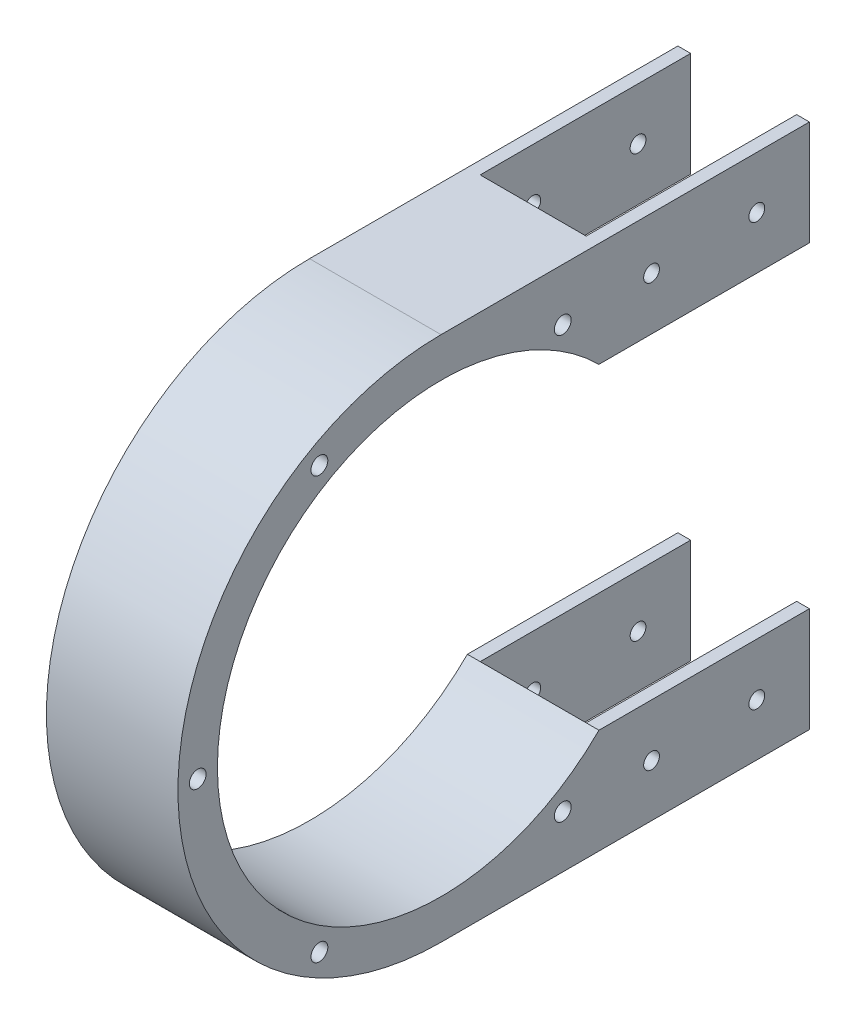
ISO-10303-21;
HEADER;
FILE_DESCRIPTION(('STEP AP214'),'2;1');
FILE_NAME('part.step','',(''),(''),'','','');
FILE_SCHEMA(('AUTOMOTIVE_DESIGN { 1 0 10303 214 1 1 1 1 }'));
ENDSEC;
DATA;
#1=APPLICATION_CONTEXT('core data for automotive mechanical design processes');
#2=APPLICATION_PROTOCOL_DEFINITION('international standard','automotive_design',2000,#1);
#3=PRODUCT_CONTEXT('',#1,'mechanical');
#4=PRODUCT('Part','Part','',(#3));
#5=PRODUCT_RELATED_PRODUCT_CATEGORY('part','',(#4));
#6=PRODUCT_DEFINITION_FORMATION('','',#4);
#7=PRODUCT_DEFINITION_CONTEXT('part definition',#1,'design');
#8=PRODUCT_DEFINITION('design','',#6,#7);
#9=PRODUCT_DEFINITION_SHAPE('','',#8);
#10=(LENGTH_UNIT() NAMED_UNIT(*) SI_UNIT(.MILLI.,.METRE.));
#11=(NAMED_UNIT(*) PLANE_ANGLE_UNIT() SI_UNIT($,.RADIAN.));
#12=(NAMED_UNIT(*) SI_UNIT($,.STERADIAN.) SOLID_ANGLE_UNIT());
#13=UNCERTAINTY_MEASURE_WITH_UNIT(LENGTH_MEASURE(1.E-05),#10,'distance_accuracy_value','');
#14=(GEOMETRIC_REPRESENTATION_CONTEXT(3) GLOBAL_UNCERTAINTY_ASSIGNED_CONTEXT((#13)) GLOBAL_UNIT_ASSIGNED_CONTEXT((#10,
#11,#12)) REPRESENTATION_CONTEXT('',''));
#15=CARTESIAN_POINT('',(0.,0.,0.));
#16=DIRECTION('',(0.,0.,1.));
#17=DIRECTION('',(1.,0.,0.));
#18=AXIS2_PLACEMENT_3D('',#15,#16,#17);
#19=CARTESIAN_POINT('',(25.,0.,-30.));
#20=DIRECTION('',(0.,0.,-1.));
#21=DIRECTION('',(-1.,0.,0.));
#22=AXIS2_PLACEMENT_3D('',#19,#20,#21);
#23=PLANE('',#22);
#24=DIRECTION('',(-1.,0.,0.));
#25=VECTOR('',#24,1.);
#26=CARTESIAN_POINT('',(25.,-30.1039864469807,-30.));
#27=LINE('',#26,#25);
#28=CARTESIAN_POINT('',(22.57,-30.1039864469807,-30.));
#29=VERTEX_POINT('',#28);
#30=CARTESIAN_POINT('',(2.42999999999999,-30.1039864469807,-30.));
#31=VERTEX_POINT('',#30);
#32=EDGE_CURVE('E51',#29,#31,#27,.T.);
#33=ORIENTED_EDGE('',*,*,#32,.F.);
#34=DIRECTION('',(0.,1.,0.));
#35=VECTOR('',#34,1.);
#36=CARTESIAN_POINT('',(22.57,-50.,-30.));
#37=LINE('',#36,#35);
#38=CARTESIAN_POINT('',(22.57,-50.,-30.));
#39=VERTEX_POINT('',#38);
#40=EDGE_CURVE('E62',#39,#29,#37,.T.);
#41=ORIENTED_EDGE('',*,*,#40,.F.);
#42=DIRECTION('',(-1.,0.,0.));
#43=VECTOR('',#42,1.);
#44=CARTESIAN_POINT('',(25.,-50.,-30.));
#45=LINE('',#44,#43);
#46=CARTESIAN_POINT('',(2.42999999999999,-50.,-30.));
#47=VERTEX_POINT('',#46);
#48=EDGE_CURVE('E274',#39,#47,#45,.T.);
#49=ORIENTED_EDGE('',*,*,#48,.T.);
#50=DIRECTION('',(0.,-1.,0.));
#51=VECTOR('',#50,1.);
#52=CARTESIAN_POINT('',(2.42999999999999,-50.,-30.));
#53=LINE('',#52,#51);
#54=EDGE_CURVE('E195',#31,#47,#53,.T.);
#55=ORIENTED_EDGE('',*,*,#54,.F.);
#56=EDGE_LOOP('',(#33,#41,#49,#55));
#57=FACE_BOUND('',#56,.T.);
#58=ADVANCED_FACE('F43',(#57),#23,.T.);
#59=CARTESIAN_POINT('',(25.,0.,-30.));
#60=DIRECTION('',(0.,0.,1.));
#61=DIRECTION('',(1.,0.,0.));
#62=AXIS2_PLACEMENT_3D('',#59,#60,#61);
#63=PLANE('',#62);
#64=DIRECTION('',(0.,-1.,0.));
#65=VECTOR('',#64,1.);
#66=CARTESIAN_POINT('',(2.43,50.,-30.));
#67=LINE('',#66,#65);
#68=CARTESIAN_POINT('',(2.43,50.,-30.));
#69=VERTEX_POINT('',#68);
#70=CARTESIAN_POINT('',(2.43,30.1039864469807,-30.));
#71=VERTEX_POINT('',#70);
#72=EDGE_CURVE('E222',#69,#71,#67,.T.);
#73=ORIENTED_EDGE('',*,*,#72,.F.);
#74=DIRECTION('',(-1.,0.,0.));
#75=VECTOR('',#74,1.);
#76=CARTESIAN_POINT('',(25.,50.,-30.));
#77=LINE('',#76,#75);
#78=CARTESIAN_POINT('',(22.57,50.,-30.));
#79=VERTEX_POINT('',#78);
#80=EDGE_CURVE('E305',#79,#69,#77,.T.);
#81=ORIENTED_EDGE('',*,*,#80,.F.);
#82=DIRECTION('',(0.,1.,0.));
#83=VECTOR('',#82,1.);
#84=CARTESIAN_POINT('',(22.57,50.,-30.));
#85=LINE('',#84,#83);
#86=CARTESIAN_POINT('',(22.57,30.1039864469807,-30.));
#87=VERTEX_POINT('',#86);
#88=EDGE_CURVE('E226',#87,#79,#85,.T.);
#89=ORIENTED_EDGE('',*,*,#88,.F.);
#90=DIRECTION('',(-1.,0.,0.));
#91=VECTOR('',#90,1.);
#92=CARTESIAN_POINT('',(25.,30.1039864469807,-30.));
#93=LINE('',#92,#91);
#94=EDGE_CURVE('E308',#87,#71,#93,.T.);
#95=ORIENTED_EDGE('',*,*,#94,.T.);
#96=EDGE_LOOP('',(#73,#81,#89,#95));
#97=FACE_BOUND('',#96,.T.);
#98=ADVANCED_FACE('F367',(#97),#63,.F.);
#99=CARTESIAN_POINT('',(25.,0.,0.));
#100=DIRECTION('',(-1.,0.,0.));
#101=DIRECTION('',(0.,0.,1.));
#102=AXIS2_PLACEMENT_3D('',#99,#100,#101);
#103=CYLINDRICAL_SURFACE('',#102,42.5);
#104=CARTESIAN_POINT('',(0.,0.,0.));
#105=DIRECTION('',(1.,0.,0.));
#106=DIRECTION('',(0.,0.,-1.));
#107=AXIS2_PLACEMENT_3D('',#104,#105,#106);
#108=CIRCLE('',#107,42.5);
#109=CARTESIAN_POINT('',(0.,30.1039864469807,-30.));
#110=VERTEX_POINT('',#109);
#111=CARTESIAN_POINT('',(0.,-30.1039864469807,-30.));
#112=VERTEX_POINT('',#111);
#113=EDGE_CURVE('E253',#110,#112,#108,.T.);
#114=ORIENTED_EDGE('',*,*,#113,.F.);
#115=DIRECTION('',(-1.,0.,0.));
#116=VECTOR('',#115,1.);
#117=CARTESIAN_POINT('',(0.,30.1039864469807,-30.));
#118=LINE('',#117,#116);
#119=EDGE_CURVE('E219',#71,#110,#118,.T.);
#120=ORIENTED_EDGE('',*,*,#119,.F.);
#121=ORIENTED_EDGE('',*,*,#94,.F.);
#122=CARTESIAN_POINT('',(25.,30.1039864469807,-30.));
#123=VERTEX_POINT('',#122);
#124=EDGE_CURVE('E309',#123,#87,#93,.T.);
#125=ORIENTED_EDGE('',*,*,#124,.F.);
#126=CARTESIAN_POINT('',(25.,0.,0.));
#127=DIRECTION('',(1.,0.,0.));
#128=DIRECTION('',(0.,0.,-1.));
#129=AXIS2_PLACEMENT_3D('',#126,#127,#128);
#130=CIRCLE('',#129,42.5);
#131=CARTESIAN_POINT('',(25.,-30.1039864469807,-30.));
#132=VERTEX_POINT('',#131);
#133=EDGE_CURVE('E254',#123,#132,#130,.T.);
#134=ORIENTED_EDGE('',*,*,#133,.T.);
#135=EDGE_CURVE('E11',#132,#29,#27,.T.);
#136=ORIENTED_EDGE('',*,*,#135,.T.);
#137=ORIENTED_EDGE('',*,*,#32,.T.);
#138=DIRECTION('',(1.,0.,0.));
#139=VECTOR('',#138,1.);
#140=CARTESIAN_POINT('',(0.,-30.1039864469807,-30.));
#141=LINE('',#140,#139);
#142=EDGE_CURVE('E198',#112,#31,#141,.T.);
#143=ORIENTED_EDGE('',*,*,#142,.F.);
#144=EDGE_LOOP('',(#114,#120,#121,#125,#134,#136,#137,#143));
#145=FACE_BOUND('',#144,.T.);
#146=ADVANCED_FACE('F347',(#145),#103,.F.);
#147=CARTESIAN_POINT('',(25.,50.,0.));
#148=DIRECTION('',(0.,-1.,0.));
#149=DIRECTION('',(0.,0.,-1.));
#150=AXIS2_PLACEMENT_3D('',#147,#148,#149);
#151=PLANE('',#150);
#152=DIRECTION('',(0.,0.,1.));
#153=VECTOR('',#152,1.);
#154=CARTESIAN_POINT('',(0.,50.,0.));
#155=LINE('',#154,#153);
#156=CARTESIAN_POINT('',(0.,50.,-70.));
#157=VERTEX_POINT('',#156);
#158=CARTESIAN_POINT('',(0.,50.,0.));
#159=VERTEX_POINT('',#158);
#160=EDGE_CURVE('E277',#157,#159,#155,.T.);
#161=ORIENTED_EDGE('',*,*,#160,.T.);
#162=DIRECTION('',(-1.,0.,0.));
#163=VECTOR('',#162,1.);
#164=CARTESIAN_POINT('',(25.,50.,0.));
#165=LINE('',#164,#163);
#166=CARTESIAN_POINT('',(25.,50.,0.));
#167=VERTEX_POINT('',#166);
#168=EDGE_CURVE('E302',#167,#159,#165,.T.);
#169=ORIENTED_EDGE('',*,*,#168,.F.);
#170=DIRECTION('',(0.,0.,1.));
#171=VECTOR('',#170,1.);
#172=CARTESIAN_POINT('',(25.,50.,0.));
#173=LINE('',#172,#171);
#174=CARTESIAN_POINT('',(25.,50.,-70.));
#175=VERTEX_POINT('',#174);
#176=EDGE_CURVE('E256',#175,#167,#173,.T.);
#177=ORIENTED_EDGE('',*,*,#176,.F.);
#178=DIRECTION('',(1.,0.,0.));
#179=VECTOR('',#178,1.);
#180=CARTESIAN_POINT('',(25.,50.,-70.));
#181=LINE('',#180,#179);
#182=CARTESIAN_POINT('',(22.57,50.,-70.));
#183=VERTEX_POINT('',#182);
#184=EDGE_CURVE('E241',#183,#175,#181,.T.);
#185=ORIENTED_EDGE('',*,*,#184,.F.);
#186=DIRECTION('',(0.,0.,1.));
#187=VECTOR('',#186,1.);
#188=CARTESIAN_POINT('',(22.57,50.,-70.));
#189=LINE('',#188,#187);
#190=EDGE_CURVE('E244',#183,#79,#189,.T.);
#191=ORIENTED_EDGE('',*,*,#190,.T.);
#192=ORIENTED_EDGE('',*,*,#80,.T.);
#193=DIRECTION('',(0.,0.,1.));
#194=VECTOR('',#193,1.);
#195=CARTESIAN_POINT('',(2.43,50.,-70.));
#196=LINE('',#195,#194);
#197=CARTESIAN_POINT('',(2.43,50.,-70.));
#198=VERTEX_POINT('',#197);
#199=EDGE_CURVE('E202',#198,#69,#196,.T.);
#200=ORIENTED_EDGE('',*,*,#199,.F.);
#201=DIRECTION('',(1.,0.,0.));
#202=VECTOR('',#201,1.);
#203=CARTESIAN_POINT('',(0.,50.,-70.));
#204=LINE('',#203,#202);
#205=EDGE_CURVE('E230',#157,#198,#204,.T.);
#206=ORIENTED_EDGE('',*,*,#205,.F.);
#207=EDGE_LOOP('',(#161,#169,#177,#185,#191,#192,#200,#206));
#208=FACE_BOUND('',#207,.T.);
#209=ADVANCED_FACE('F376',(#208),#151,.F.);
#210=CARTESIAN_POINT('',(25.,0.,0.));
#211=DIRECTION('',(-1.,0.,0.));
#212=DIRECTION('',(0.,0.,1.));
#213=AXIS2_PLACEMENT_3D('',#210,#211,#212);
#214=CYLINDRICAL_SURFACE('',#213,50.);
#215=CARTESIAN_POINT('',(0.,0.,0.));
#216=DIRECTION('',(1.,0.,0.));
#217=DIRECTION('',(0.,0.,-1.));
#218=AXIS2_PLACEMENT_3D('',#215,#216,#217);
#219=CIRCLE('',#218,50.);
#220=CARTESIAN_POINT('',(0.,-50.,0.));
#221=VERTEX_POINT('',#220);
#222=EDGE_CURVE('E279',#159,#221,#219,.T.);
#223=ORIENTED_EDGE('',*,*,#222,.T.);
#224=DIRECTION('',(-1.,0.,0.));
#225=VECTOR('',#224,1.);
#226=CARTESIAN_POINT('',(25.,-50.,0.));
#227=LINE('',#226,#225);
#228=CARTESIAN_POINT('',(25.,-50.,0.));
#229=VERTEX_POINT('',#228);
#230=EDGE_CURVE('E300',#229,#221,#227,.T.);
#231=ORIENTED_EDGE('',*,*,#230,.F.);
#232=CARTESIAN_POINT('',(25.,0.,0.));
#233=DIRECTION('',(1.,0.,0.));
#234=DIRECTION('',(0.,0.,-1.));
#235=AXIS2_PLACEMENT_3D('',#232,#233,#234);
#236=CIRCLE('',#235,50.);
#237=EDGE_CURVE('E161',#167,#229,#236,.T.);
#238=ORIENTED_EDGE('',*,*,#237,.F.);
#239=ORIENTED_EDGE('',*,*,#168,.T.);
#240=EDGE_LOOP('',(#223,#231,#238,#239));
#241=FACE_BOUND('',#240,.T.);
#242=ADVANCED_FACE('F380',(#241),#214,.T.);
#243=CARTESIAN_POINT('',(25.,-40.05367492503,23.1250000000005));
#244=DIRECTION('',(-1.,0.,0.));
#245=DIRECTION('',(0.,0.,1.));
#246=AXIS2_PLACEMENT_3D('',#243,#244,#245);
#247=CYLINDRICAL_SURFACE('',#246,1.6);
#248=CARTESIAN_POINT('',(25.,-40.05367492503,23.1250000000005));
#249=DIRECTION('',(1.,0.,0.));
#250=DIRECTION('',(0.,0.,-1.));
#251=AXIS2_PLACEMENT_3D('',#248,#249,#250);
#252=CIRCLE('',#251,1.6);
#253=CARTESIAN_POINT('',(25.,-40.05367492503,21.5250000000005));
#254=VERTEX_POINT('',#253);
#255=EDGE_CURVE('E268',#254,#254,#252,.T.);
#256=ORIENTED_EDGE('',*,*,#255,.T.);
#257=EDGE_LOOP('',(#256));
#258=FACE_BOUND('',#257,.T.);
#259=CARTESIAN_POINT('',(0.,-40.05367492503,23.1250000000005));
#260=DIRECTION('',(1.,0.,0.));
#261=DIRECTION('',(0.,0.,-1.));
#262=AXIS2_PLACEMENT_3D('',#259,#260,#261);
#263=CIRCLE('',#262,1.6);
#264=CARTESIAN_POINT('',(0.,-40.05367492503,21.5250000000005));
#265=VERTEX_POINT('',#264);
#266=EDGE_CURVE('E294',#265,#265,#263,.T.);
#267=ORIENTED_EDGE('',*,*,#266,.F.);
#268=EDGE_LOOP('',(#267));
#269=FACE_BOUND('',#268,.T.);
#270=ADVANCED_FACE('F384',(#258,#269),#247,.F.);
#271=CARTESIAN_POINT('',(25.,0.,46.25));
#272=DIRECTION('',(-1.,0.,0.));
#273=DIRECTION('',(0.,0.,1.));
#274=AXIS2_PLACEMENT_3D('',#271,#272,#273);
#275=CYLINDRICAL_SURFACE('',#274,1.6);
#276=CARTESIAN_POINT('',(25.,0.,46.25));
#277=DIRECTION('',(1.,0.,0.));
#278=DIRECTION('',(0.,0.,-1.));
#279=AXIS2_PLACEMENT_3D('',#276,#277,#278);
#280=CIRCLE('',#279,1.6);
#281=CARTESIAN_POINT('',(25.,0.,44.65));
#282=VERTEX_POINT('',#281);
#283=EDGE_CURVE('E265',#282,#282,#280,.T.);
#284=ORIENTED_EDGE('',*,*,#283,.T.);
#285=EDGE_LOOP('',(#284));
#286=FACE_BOUND('',#285,.T.);
#287=CARTESIAN_POINT('',(0.,0.,46.25));
#288=DIRECTION('',(1.,0.,0.));
#289=DIRECTION('',(0.,0.,-1.));
#290=AXIS2_PLACEMENT_3D('',#287,#288,#289);
#291=CIRCLE('',#290,1.6);
#292=CARTESIAN_POINT('',(0.,0.,44.65));
#293=VERTEX_POINT('',#292);
#294=EDGE_CURVE('E291',#293,#293,#291,.T.);
#295=ORIENTED_EDGE('',*,*,#294,.F.);
#296=EDGE_LOOP('',(#295));
#297=FACE_BOUND('',#296,.T.);
#298=ADVANCED_FACE('F396',(#286,#297),#275,.F.);
#299=CARTESIAN_POINT('',(25.,40.0536749250303,23.1249999999999));
#300=DIRECTION('',(-1.,0.,0.));
#301=DIRECTION('',(0.,0.,1.));
#302=AXIS2_PLACEMENT_3D('',#299,#300,#301);
#303=CYLINDRICAL_SURFACE('',#302,1.6);
#304=CARTESIAN_POINT('',(25.,40.0536749250303,23.1249999999999));
#305=DIRECTION('',(1.,0.,0.));
#306=DIRECTION('',(0.,0.,-1.));
#307=AXIS2_PLACEMENT_3D('',#304,#305,#306);
#308=CIRCLE('',#307,1.6);
#309=CARTESIAN_POINT('',(25.,40.0536749250303,21.5249999999999));
#310=VERTEX_POINT('',#309);
#311=EDGE_CURVE('E262',#310,#310,#308,.T.);
#312=ORIENTED_EDGE('',*,*,#311,.T.);
#313=EDGE_LOOP('',(#312));
#314=FACE_BOUND('',#313,.T.);
#315=CARTESIAN_POINT('',(0.,40.0536749250303,23.1249999999999));
#316=DIRECTION('',(1.,0.,0.));
#317=DIRECTION('',(0.,0.,-1.));
#318=AXIS2_PLACEMENT_3D('',#315,#316,#317);
#319=CIRCLE('',#318,1.6);
#320=CARTESIAN_POINT('',(0.,40.0536749250303,21.5249999999999));
#321=VERTEX_POINT('',#320);
#322=EDGE_CURVE('E288',#321,#321,#319,.T.);
#323=ORIENTED_EDGE('',*,*,#322,.F.);
#324=EDGE_LOOP('',(#323));
#325=FACE_BOUND('',#324,.T.);
#326=ADVANCED_FACE('F392',(#314,#325),#303,.F.);
#327=CARTESIAN_POINT('',(25.,40.0536749250313,-23.1249999999994));
#328=DIRECTION('',(-1.,0.,0.));
#329=DIRECTION('',(0.,0.,1.));
#330=AXIS2_PLACEMENT_3D('',#327,#328,#329);
#331=CYLINDRICAL_SURFACE('',#330,1.60000000000087);
#332=CARTESIAN_POINT('',(25.,40.0536749250313,-23.1249999999994));
#333=DIRECTION('',(1.,0.,0.));
#334=DIRECTION('',(0.,0.,-1.));
#335=AXIS2_PLACEMENT_3D('',#332,#333,#334);
#336=CIRCLE('',#335,1.60000000000087);
#337=CARTESIAN_POINT('',(25.,40.0536749250313,-24.7250000000003));
#338=VERTEX_POINT('',#337);
#339=EDGE_CURVE('E165',#338,#338,#336,.T.);
#340=ORIENTED_EDGE('',*,*,#339,.T.);
#341=EDGE_LOOP('',(#340));
#342=FACE_BOUND('',#341,.T.);
#343=CARTESIAN_POINT('',(0.,40.0536749250313,-23.1249999999994));
#344=DIRECTION('',(1.,0.,0.));
#345=DIRECTION('',(0.,0.,-1.));
#346=AXIS2_PLACEMENT_3D('',#343,#344,#345);
#347=CIRCLE('',#346,1.60000000000087);
#348=CARTESIAN_POINT('',(0.,40.0536749250313,-24.7250000000003));
#349=VERTEX_POINT('',#348);
#350=EDGE_CURVE('E285',#349,#349,#347,.T.);
#351=ORIENTED_EDGE('',*,*,#350,.F.);
#352=EDGE_LOOP('',(#351));
#353=FACE_BOUND('',#352,.T.);
#354=ADVANCED_FACE('F389',(#342,#353),#331,.F.);
#355=CARTESIAN_POINT('',(25.,-50.,0.));
#356=DIRECTION('',(0.,-1.,0.));
#357=DIRECTION('',(0.,0.,-1.));
#358=AXIS2_PLACEMENT_3D('',#355,#356,#357);
#359=PLANE('',#358);
#360=DIRECTION('',(0.,0.,1.));
#361=VECTOR('',#360,1.);
#362=CARTESIAN_POINT('',(0.,-50.,0.));
#363=LINE('',#362,#361);
#364=CARTESIAN_POINT('',(0.,-50.,-70.));
#365=VERTEX_POINT('',#364);
#366=EDGE_CURVE('E282',#365,#221,#363,.T.);
#367=ORIENTED_EDGE('',*,*,#366,.F.);
#368=DIRECTION('',(-1.,0.,0.));
#369=VECTOR('',#368,1.);
#370=CARTESIAN_POINT('',(0.,-50.,-70.));
#371=LINE('',#370,#369);
#372=CARTESIAN_POINT('',(2.42999999999999,-50.,-70.));
#373=VERTEX_POINT('',#372);
#374=EDGE_CURVE('E199',#373,#365,#371,.T.);
#375=ORIENTED_EDGE('',*,*,#374,.F.);
#376=DIRECTION('',(0.,0.,1.));
#377=VECTOR('',#376,1.);
#378=CARTESIAN_POINT('',(2.42999999999999,-50.,-70.));
#379=LINE('',#378,#377);
#380=EDGE_CURVE('E191',#373,#47,#379,.T.);
#381=ORIENTED_EDGE('',*,*,#380,.T.);
#382=ORIENTED_EDGE('',*,*,#48,.F.);
#383=DIRECTION('',(0.,0.,1.));
#384=VECTOR('',#383,1.);
#385=CARTESIAN_POINT('',(22.57,-50.,-70.));
#386=LINE('',#385,#384);
#387=CARTESIAN_POINT('',(22.57,-50.,-70.));
#388=VERTEX_POINT('',#387);
#389=EDGE_CURVE('E179',#388,#39,#386,.T.);
#390=ORIENTED_EDGE('',*,*,#389,.F.);
#391=DIRECTION('',(-1.,0.,0.));
#392=VECTOR('',#391,1.);
#393=CARTESIAN_POINT('',(25.,-50.,-70.));
#394=LINE('',#393,#392);
#395=CARTESIAN_POINT('',(25.,-50.,-70.));
#396=VERTEX_POINT('',#395);
#397=EDGE_CURVE('E170',#396,#388,#394,.T.);
#398=ORIENTED_EDGE('',*,*,#397,.F.);
#399=DIRECTION('',(0.,0.,1.));
#400=VECTOR('',#399,1.);
#401=CARTESIAN_POINT('',(25.,-50.,0.));
#402=LINE('',#401,#400);
#403=EDGE_CURVE('E154',#396,#229,#402,.T.);
#404=ORIENTED_EDGE('',*,*,#403,.T.);
#405=ORIENTED_EDGE('',*,*,#230,.T.);
#406=EDGE_LOOP('',(#367,#375,#381,#382,#390,#398,#404,#405));
#407=FACE_BOUND('',#406,.T.);
#408=ADVANCED_FACE('F177',(#407),#359,.T.);
#409=CARTESIAN_POINT('',(25.,-40.0536749250293,-23.1250000000006));
#410=DIRECTION('',(-1.,0.,0.));
#411=DIRECTION('',(0.,0.,1.));
#412=AXIS2_PLACEMENT_3D('',#409,#410,#411);
#413=CYLINDRICAL_SURFACE('',#412,1.59999999999986);
#414=CARTESIAN_POINT('',(25.,-40.0536749250293,-23.1250000000006));
#415=DIRECTION('',(1.,0.,0.));
#416=DIRECTION('',(0.,0.,-1.));
#417=AXIS2_PLACEMENT_3D('',#414,#415,#416);
#418=CIRCLE('',#417,1.59999999999986);
#419=CARTESIAN_POINT('',(25.,-40.0536749250293,-24.7250000000004));
#420=VERTEX_POINT('',#419);
#421=EDGE_CURVE('E271',#420,#420,#418,.T.);
#422=ORIENTED_EDGE('',*,*,#421,.T.);
#423=EDGE_LOOP('',(#422));
#424=FACE_BOUND('',#423,.T.);
#425=CARTESIAN_POINT('',(0.,-40.0536749250293,-23.1250000000006));
#426=DIRECTION('',(1.,0.,0.));
#427=DIRECTION('',(0.,0.,-1.));
#428=AXIS2_PLACEMENT_3D('',#425,#426,#427);
#429=CIRCLE('',#428,1.59999999999986);
#430=CARTESIAN_POINT('',(0.,-40.0536749250293,-24.7250000000004));
#431=VERTEX_POINT('',#430);
#432=EDGE_CURVE('E257',#431,#431,#429,.T.);
#433=ORIENTED_EDGE('',*,*,#432,.F.);
#434=EDGE_LOOP('',(#433));
#435=FACE_BOUND('',#434,.T.);
#436=ADVANCED_FACE('F388',(#424,#435),#413,.F.);
#437=CARTESIAN_POINT('',(25.,0.,0.));
#438=DIRECTION('',(1.,0.,0.));
#439=DIRECTION('',(0.,0.,-1.));
#440=AXIS2_PLACEMENT_3D('',#437,#438,#439);
#441=PLANE('',#440);
#442=CARTESIAN_POINT('',(25.,40.1039864469807,-60.));
#443=DIRECTION('',(1.,0.,0.));
#444=DIRECTION('',(0.,0.,1.));
#445=AXIS2_PLACEMENT_3D('',#442,#443,#444);
#446=CIRCLE('',#445,1.5);
#447=CARTESIAN_POINT('',(25.,40.1039864469807,-58.5));
#448=VERTEX_POINT('',#447);
#449=EDGE_CURVE('E526',#448,#448,#446,.T.);
#450=ORIENTED_EDGE('',*,*,#449,.F.);
#451=EDGE_LOOP('',(#450));
#452=FACE_BOUND('',#451,.T.);
#453=CARTESIAN_POINT('',(25.,40.1039864469807,-40.));
#454=DIRECTION('',(1.,0.,0.));
#455=DIRECTION('',(0.,0.,1.));
#456=AXIS2_PLACEMENT_3D('',#453,#454,#455);
#457=CIRCLE('',#456,1.5);
#458=CARTESIAN_POINT('',(25.,40.1039864469807,-38.5));
#459=VERTEX_POINT('',#458);
#460=EDGE_CURVE('E532',#459,#459,#457,.T.);
#461=ORIENTED_EDGE('',*,*,#460,.F.);
#462=EDGE_LOOP('',(#461));
#463=FACE_BOUND('',#462,.T.);
#464=CARTESIAN_POINT('',(25.,-40.1039864469807,-40.));
#465=DIRECTION('',(1.,0.,0.));
#466=DIRECTION('',(0.,0.,-1.));
#467=AXIS2_PLACEMENT_3D('',#464,#465,#466);
#468=CIRCLE('',#467,1.5);
#469=CARTESIAN_POINT('',(25.,-40.1039864469807,-41.5));
#470=VERTEX_POINT('',#469);
#471=EDGE_CURVE('E521',#470,#470,#468,.T.);
#472=ORIENTED_EDGE('',*,*,#471,.F.);
#473=EDGE_LOOP('',(#472));
#474=FACE_BOUND('',#473,.T.);
#475=CARTESIAN_POINT('',(25.,-40.1039864469807,-60.));
#476=DIRECTION('',(1.,0.,0.));
#477=DIRECTION('',(0.,0.,-1.));
#478=AXIS2_PLACEMENT_3D('',#475,#476,#477);
#479=CIRCLE('',#478,1.5);
#480=CARTESIAN_POINT('',(25.,-40.1039864469807,-61.5));
#481=VERTEX_POINT('',#480);
#482=EDGE_CURVE('E519',#481,#481,#479,.T.);
#483=ORIENTED_EDGE('',*,*,#482,.F.);
#484=EDGE_LOOP('',(#483));
#485=FACE_BOUND('',#484,.T.);
#486=ORIENTED_EDGE('',*,*,#403,.F.);
#487=DIRECTION('',(0.,-1.,0.));
#488=VECTOR('',#487,1.);
#489=CARTESIAN_POINT('',(25.,-50.,-70.));
#490=LINE('',#489,#488);
#491=CARTESIAN_POINT('',(25.,-30.1039864469807,-70.));
#492=VERTEX_POINT('',#491);
#493=EDGE_CURVE('E159',#492,#396,#490,.T.);
#494=ORIENTED_EDGE('',*,*,#493,.F.);
#495=DIRECTION('',(0.,0.,1.));
#496=VECTOR('',#495,1.);
#497=CARTESIAN_POINT('',(25.,-30.1039864469807,-70.));
#498=LINE('',#497,#496);
#499=EDGE_CURVE('E175',#492,#132,#498,.T.);
#500=ORIENTED_EDGE('',*,*,#499,.T.);
#501=ORIENTED_EDGE('',*,*,#133,.F.);
#502=DIRECTION('',(0.,0.,1.));
#503=VECTOR('',#502,1.);
#504=CARTESIAN_POINT('',(25.,30.1039864469807,-70.));
#505=LINE('',#504,#503);
#506=CARTESIAN_POINT('',(25.,30.1039864469807,-70.));
#507=VERTEX_POINT('',#506);
#508=EDGE_CURVE('E251',#507,#123,#505,.T.);
#509=ORIENTED_EDGE('',*,*,#508,.F.);
#510=DIRECTION('',(0.,-1.,0.));
#511=VECTOR('',#510,1.);
#512=CARTESIAN_POINT('',(25.,50.,-70.));
#513=LINE('',#512,#511);
#514=EDGE_CURVE('E234',#175,#507,#513,.T.);
#515=ORIENTED_EDGE('',*,*,#514,.F.);
#516=ORIENTED_EDGE('',*,*,#176,.T.);
#517=ORIENTED_EDGE('',*,*,#237,.T.);
#518=EDGE_LOOP('',(#486,#494,#500,#501,#509,#515,#516,#517));
#519=FACE_BOUND('',#518,.T.);
#520=ORIENTED_EDGE('',*,*,#339,.F.);
#521=EDGE_LOOP('',(#520));
#522=FACE_BOUND('',#521,.T.);
#523=ORIENTED_EDGE('',*,*,#311,.F.);
#524=EDGE_LOOP('',(#523));
#525=FACE_BOUND('',#524,.T.);
#526=ORIENTED_EDGE('',*,*,#283,.F.);
#527=EDGE_LOOP('',(#526));
#528=FACE_BOUND('',#527,.T.);
#529=ORIENTED_EDGE('',*,*,#255,.F.);
#530=EDGE_LOOP('',(#529));
#531=FACE_BOUND('',#530,.T.);
#532=ORIENTED_EDGE('',*,*,#421,.F.);
#533=EDGE_LOOP('',(#532));
#534=FACE_BOUND('',#533,.T.);
#535=ADVANCED_FACE('F156',(#452,#463,#474,#485,#519,#522,#525,#528,#531,#534),#441,.T.);
#536=CARTESIAN_POINT('',(0.,0.,0.));
#537=DIRECTION('',(1.,0.,0.));
#538=DIRECTION('',(0.,0.,-1.));
#539=AXIS2_PLACEMENT_3D('',#536,#537,#538);
#540=PLANE('',#539);
#541=CARTESIAN_POINT('',(0.,40.1039864469807,-60.));
#542=DIRECTION('',(1.,0.,0.));
#543=DIRECTION('',(0.,0.,1.));
#544=AXIS2_PLACEMENT_3D('',#541,#542,#543);
#545=CIRCLE('',#544,1.5);
#546=CARTESIAN_POINT('',(0.,40.1039864469807,-58.5));
#547=VERTEX_POINT('',#546);
#548=EDGE_CURVE('E523',#547,#547,#545,.T.);
#549=ORIENTED_EDGE('',*,*,#548,.T.);
#550=EDGE_LOOP('',(#549));
#551=FACE_BOUND('',#550,.T.);
#552=CARTESIAN_POINT('',(0.,40.1039864469807,-40.));
#553=DIRECTION('',(1.,0.,0.));
#554=DIRECTION('',(0.,0.,1.));
#555=AXIS2_PLACEMENT_3D('',#552,#553,#554);
#556=CIRCLE('',#555,1.5);
#557=CARTESIAN_POINT('',(0.,40.1039864469807,-38.5));
#558=VERTEX_POINT('',#557);
#559=EDGE_CURVE('E529',#558,#558,#556,.T.);
#560=ORIENTED_EDGE('',*,*,#559,.T.);
#561=EDGE_LOOP('',(#560));
#562=FACE_BOUND('',#561,.T.);
#563=CARTESIAN_POINT('',(0.,-40.1039864469807,-40.));
#564=DIRECTION('',(1.,0.,0.));
#565=DIRECTION('',(0.,0.,-1.));
#566=AXIS2_PLACEMENT_3D('',#563,#564,#565);
#567=CIRCLE('',#566,1.5);
#568=CARTESIAN_POINT('',(0.,-40.1039864469807,-41.5));
#569=VERTEX_POINT('',#568);
#570=EDGE_CURVE('E535',#569,#569,#567,.T.);
#571=ORIENTED_EDGE('',*,*,#570,.T.);
#572=EDGE_LOOP('',(#571));
#573=FACE_BOUND('',#572,.T.);
#574=CARTESIAN_POINT('',(0.,-40.1039864469807,-60.));
#575=DIRECTION('',(1.,0.,0.));
#576=DIRECTION('',(0.,0.,-1.));
#577=AXIS2_PLACEMENT_3D('',#574,#575,#576);
#578=CIRCLE('',#577,1.5);
#579=CARTESIAN_POINT('',(0.,-40.1039864469807,-61.5));
#580=VERTEX_POINT('',#579);
#581=EDGE_CURVE('E315',#580,#580,#578,.T.);
#582=ORIENTED_EDGE('',*,*,#581,.T.);
#583=EDGE_LOOP('',(#582));
#584=FACE_BOUND('',#583,.T.);
#585=ORIENTED_EDGE('',*,*,#113,.T.);
#586=DIRECTION('',(0.,0.,1.));
#587=VECTOR('',#586,1.);
#588=CARTESIAN_POINT('',(0.,-30.1039864469807,-70.));
#589=LINE('',#588,#587);
#590=CARTESIAN_POINT('',(0.,-30.1039864469807,-70.));
#591=VERTEX_POINT('',#590);
#592=EDGE_CURVE('E182',#591,#112,#589,.T.);
#593=ORIENTED_EDGE('',*,*,#592,.F.);
#594=DIRECTION('',(0.,1.,0.));
#595=VECTOR('',#594,1.);
#596=CARTESIAN_POINT('',(0.,-50.,-70.));
#597=LINE('',#596,#595);
#598=EDGE_CURVE('E206',#365,#591,#597,.T.);
#599=ORIENTED_EDGE('',*,*,#598,.F.);
#600=ORIENTED_EDGE('',*,*,#366,.T.);
#601=ORIENTED_EDGE('',*,*,#222,.F.);
#602=ORIENTED_EDGE('',*,*,#160,.F.);
#603=DIRECTION('',(0.,1.,0.));
#604=VECTOR('',#603,1.);
#605=CARTESIAN_POINT('',(0.,50.,-70.));
#606=LINE('',#605,#604);
#607=CARTESIAN_POINT('',(0.,30.1039864469807,-70.));
#608=VERTEX_POINT('',#607);
#609=EDGE_CURVE('E223',#608,#157,#606,.T.);
#610=ORIENTED_EDGE('',*,*,#609,.F.);
#611=DIRECTION('',(0.,0.,1.));
#612=VECTOR('',#611,1.);
#613=CARTESIAN_POINT('',(0.,30.1039864469807,-70.));
#614=LINE('',#613,#612);
#615=EDGE_CURVE('E215',#608,#110,#614,.T.);
#616=ORIENTED_EDGE('',*,*,#615,.T.);
#617=EDGE_LOOP('',(#585,#593,#599,#600,#601,#602,#610,#616));
#618=FACE_BOUND('',#617,.T.);
#619=ORIENTED_EDGE('',*,*,#350,.T.);
#620=EDGE_LOOP('',(#619));
#621=FACE_BOUND('',#620,.T.);
#622=ORIENTED_EDGE('',*,*,#322,.T.);
#623=EDGE_LOOP('',(#622));
#624=FACE_BOUND('',#623,.T.);
#625=ORIENTED_EDGE('',*,*,#294,.T.);
#626=EDGE_LOOP('',(#625));
#627=FACE_BOUND('',#626,.T.);
#628=ORIENTED_EDGE('',*,*,#266,.T.);
#629=EDGE_LOOP('',(#628));
#630=FACE_BOUND('',#629,.T.);
#631=ORIENTED_EDGE('',*,*,#432,.T.);
#632=EDGE_LOOP('',(#631));
#633=FACE_BOUND('',#632,.T.);
#634=ADVANCED_FACE('F407',(#551,#562,#573,#584,#618,#621,#624,#627,#630,#633),#540,.F.);
#635=CARTESIAN_POINT('',(25.,30.1039864469807,-70.));
#636=DIRECTION('',(0.,1.,0.));
#637=DIRECTION('',(0.,0.,1.));
#638=AXIS2_PLACEMENT_3D('',#635,#636,#637);
#639=PLANE('',#638);
#640=ORIENTED_EDGE('',*,*,#124,.T.);
#641=DIRECTION('',(0.,0.,1.));
#642=VECTOR('',#641,1.);
#643=CARTESIAN_POINT('',(22.57,30.1039864469807,-70.));
#644=LINE('',#643,#642);
#645=CARTESIAN_POINT('',(22.57,30.1039864469807,-70.));
#646=VERTEX_POINT('',#645);
#647=EDGE_CURVE('E248',#646,#87,#644,.T.);
#648=ORIENTED_EDGE('',*,*,#647,.F.);
#649=DIRECTION('',(-1.,0.,0.));
#650=VECTOR('',#649,1.);
#651=CARTESIAN_POINT('',(25.,30.1039864469807,-70.));
#652=LINE('',#651,#650);
#653=EDGE_CURVE('E237',#507,#646,#652,.T.);
#654=ORIENTED_EDGE('',*,*,#653,.F.);
#655=ORIENTED_EDGE('',*,*,#508,.T.);
#656=EDGE_LOOP('',(#640,#648,#654,#655));
#657=FACE_BOUND('',#656,.T.);
#658=ADVANCED_FACE('F410',(#657),#639,.F.);
#659=CARTESIAN_POINT('',(22.57,50.,-70.));
#660=DIRECTION('',(1.,0.,0.));
#661=DIRECTION('',(0.,1.,0.));
#662=AXIS2_PLACEMENT_3D('',#659,#660,#661);
#663=PLANE('',#662);
#664=CARTESIAN_POINT('',(22.57,40.1039864469807,-60.));
#665=DIRECTION('',(1.,0.,0.));
#666=DIRECTION('',(0.,1.,0.));
#667=AXIS2_PLACEMENT_3D('',#664,#665,#666);
#668=CIRCLE('',#667,1.5);
#669=CARTESIAN_POINT('',(22.57,41.6039864469807,-60.));
#670=VERTEX_POINT('',#669);
#671=EDGE_CURVE('E333',#670,#670,#668,.T.);
#672=ORIENTED_EDGE('',*,*,#671,.T.);
#673=EDGE_LOOP('',(#672));
#674=FACE_BOUND('',#673,.T.);
#675=CARTESIAN_POINT('',(22.57,40.1039864469807,-40.));
#676=DIRECTION('',(1.,0.,0.));
#677=DIRECTION('',(0.,1.,0.));
#678=AXIS2_PLACEMENT_3D('',#675,#676,#677);
#679=CIRCLE('',#678,1.5);
#680=CARTESIAN_POINT('',(22.57,41.6039864469807,-40.));
#681=VERTEX_POINT('',#680);
#682=EDGE_CURVE('E321',#681,#681,#679,.T.);
#683=ORIENTED_EDGE('',*,*,#682,.T.);
#684=EDGE_LOOP('',(#683));
#685=FACE_BOUND('',#684,.T.);
#686=ORIENTED_EDGE('',*,*,#88,.T.);
#687=ORIENTED_EDGE('',*,*,#190,.F.);
#688=DIRECTION('',(0.,1.,0.));
#689=VECTOR('',#688,1.);
#690=CARTESIAN_POINT('',(22.57,50.,-70.));
#691=LINE('',#690,#689);
#692=EDGE_CURVE('E239',#646,#183,#691,.T.);
#693=ORIENTED_EDGE('',*,*,#692,.F.);
#694=ORIENTED_EDGE('',*,*,#647,.T.);
#695=EDGE_LOOP('',(#686,#687,#693,#694));
#696=FACE_BOUND('',#695,.T.);
#697=ADVANCED_FACE('F417',(#674,#685,#696),#663,.F.);
#698=CARTESIAN_POINT('',(0.,0.,-70.));
#699=DIRECTION('',(0.,0.,-1.));
#700=DIRECTION('',(-1.,0.,0.));
#701=AXIS2_PLACEMENT_3D('',#698,#699,#700);
#702=PLANE('',#701);
#703=ORIENTED_EDGE('',*,*,#514,.T.);
#704=ORIENTED_EDGE('',*,*,#653,.T.);
#705=ORIENTED_EDGE('',*,*,#692,.T.);
#706=ORIENTED_EDGE('',*,*,#184,.T.);
#707=EDGE_LOOP('',(#703,#704,#705,#706));
#708=FACE_BOUND('',#707,.T.);
#709=ADVANCED_FACE('F421',(#708),#702,.T.);
#710=CARTESIAN_POINT('',(2.43,50.,-70.));
#711=DIRECTION('',(-1.,0.,0.));
#712=DIRECTION('',(0.,-1.,0.));
#713=AXIS2_PLACEMENT_3D('',#710,#711,#712);
#714=PLANE('',#713);
#715=CARTESIAN_POINT('',(2.43,40.1039864469807,-60.));
#716=DIRECTION('',(-1.,0.,0.));
#717=DIRECTION('',(0.,-1.,0.));
#718=AXIS2_PLACEMENT_3D('',#715,#716,#717);
#719=CIRCLE('',#718,1.5);
#720=CARTESIAN_POINT('',(2.43,38.6039864469807,-60.));
#721=VERTEX_POINT('',#720);
#722=EDGE_CURVE('E46',#721,#721,#719,.T.);
#723=ORIENTED_EDGE('',*,*,#722,.T.);
#724=EDGE_LOOP('',(#723));
#725=FACE_BOUND('',#724,.T.);
#726=CARTESIAN_POINT('',(2.43,40.1039864469807,-40.));
#727=DIRECTION('',(-1.,0.,0.));
#728=DIRECTION('',(0.,-1.,0.));
#729=AXIS2_PLACEMENT_3D('',#726,#727,#728);
#730=CIRCLE('',#729,1.5);
#731=CARTESIAN_POINT('',(2.43,38.6039864469807,-40.));
#732=VERTEX_POINT('',#731);
#733=EDGE_CURVE('E319',#732,#732,#730,.T.);
#734=ORIENTED_EDGE('',*,*,#733,.T.);
#735=EDGE_LOOP('',(#734));
#736=FACE_BOUND('',#735,.T.);
#737=ORIENTED_EDGE('',*,*,#72,.T.);
#738=DIRECTION('',(0.,0.,1.));
#739=VECTOR('',#738,1.);
#740=CARTESIAN_POINT('',(2.43,30.1039864469807,-70.));
#741=LINE('',#740,#739);
#742=CARTESIAN_POINT('',(2.43,30.1039864469807,-70.));
#743=VERTEX_POINT('',#742);
#744=EDGE_CURVE('E212',#743,#71,#741,.T.);
#745=ORIENTED_EDGE('',*,*,#744,.F.);
#746=DIRECTION('',(0.,-1.,0.));
#747=VECTOR('',#746,1.);
#748=CARTESIAN_POINT('',(2.43,50.,-70.));
#749=LINE('',#748,#747);
#750=EDGE_CURVE('E228',#198,#743,#749,.T.);
#751=ORIENTED_EDGE('',*,*,#750,.F.);
#752=ORIENTED_EDGE('',*,*,#199,.T.);
#753=EDGE_LOOP('',(#737,#745,#751,#752));
#754=FACE_BOUND('',#753,.T.);
#755=ADVANCED_FACE('F425',(#725,#736,#754),#714,.F.);
#756=CARTESIAN_POINT('',(0.,30.1039864469807,-70.));
#757=DIRECTION('',(0.,1.,0.));
#758=DIRECTION('',(0.,0.,1.));
#759=AXIS2_PLACEMENT_3D('',#756,#757,#758);
#760=PLANE('',#759);
#761=ORIENTED_EDGE('',*,*,#119,.T.);
#762=ORIENTED_EDGE('',*,*,#615,.F.);
#763=DIRECTION('',(-1.,0.,0.));
#764=VECTOR('',#763,1.);
#765=CARTESIAN_POINT('',(0.,30.1039864469807,-70.));
#766=LINE('',#765,#764);
#767=EDGE_CURVE('E218',#743,#608,#766,.T.);
#768=ORIENTED_EDGE('',*,*,#767,.F.);
#769=ORIENTED_EDGE('',*,*,#744,.T.);
#770=EDGE_LOOP('',(#761,#762,#768,#769));
#771=FACE_BOUND('',#770,.T.);
#772=ADVANCED_FACE('F431',(#771),#760,.F.);
#773=CARTESIAN_POINT('',(0.,0.,-70.));
#774=DIRECTION('',(0.,0.,1.));
#775=DIRECTION('',(1.,0.,0.));
#776=AXIS2_PLACEMENT_3D('',#773,#774,#775);
#777=PLANE('',#776);
#778=ORIENTED_EDGE('',*,*,#609,.T.);
#779=ORIENTED_EDGE('',*,*,#205,.T.);
#780=ORIENTED_EDGE('',*,*,#750,.T.);
#781=ORIENTED_EDGE('',*,*,#767,.T.);
#782=EDGE_LOOP('',(#778,#779,#780,#781));
#783=FACE_BOUND('',#782,.T.);
#784=ADVANCED_FACE('F427',(#783),#777,.F.);
#785=CARTESIAN_POINT('',(0.,-30.1039864469807,-70.));
#786=DIRECTION('',(0.,-1.,0.));
#787=DIRECTION('',(0.,0.,-1.));
#788=AXIS2_PLACEMENT_3D('',#785,#786,#787);
#789=PLANE('',#788);
#790=ORIENTED_EDGE('',*,*,#142,.T.);
#791=DIRECTION('',(0.,0.,1.));
#792=VECTOR('',#791,1.);
#793=CARTESIAN_POINT('',(2.42999999999999,-30.1039864469807,-70.));
#794=LINE('',#793,#792);
#795=CARTESIAN_POINT('',(2.42999999999999,-30.1039864469807,-70.));
#796=VERTEX_POINT('',#795);
#797=EDGE_CURVE('E188',#796,#31,#794,.T.);
#798=ORIENTED_EDGE('',*,*,#797,.F.);
#799=DIRECTION('',(1.,0.,0.));
#800=VECTOR('',#799,1.);
#801=CARTESIAN_POINT('',(0.,-30.1039864469807,-70.));
#802=LINE('',#801,#800);
#803=EDGE_CURVE('E204',#591,#796,#802,.T.);
#804=ORIENTED_EDGE('',*,*,#803,.F.);
#805=ORIENTED_EDGE('',*,*,#592,.T.);
#806=EDGE_LOOP('',(#790,#798,#804,#805));
#807=FACE_BOUND('',#806,.T.);
#808=ADVANCED_FACE('F430',(#807),#789,.F.);
#809=CARTESIAN_POINT('',(2.42999999999999,-50.,-70.));
#810=DIRECTION('',(-1.,0.,0.));
#811=DIRECTION('',(0.,-1.,0.));
#812=AXIS2_PLACEMENT_3D('',#809,#810,#811);
#813=PLANE('',#812);
#814=CARTESIAN_POINT('',(2.42999999999999,-40.1039864469807,-40.));
#815=DIRECTION('',(-1.,0.,0.));
#816=DIRECTION('',(0.,-1.,0.));
#817=AXIS2_PLACEMENT_3D('',#814,#815,#816);
#818=CIRCLE('',#817,1.5);
#819=CARTESIAN_POINT('',(2.42999999999999,-41.6039864469807,-40.));
#820=VERTEX_POINT('',#819);
#821=EDGE_CURVE('E318',#820,#820,#818,.T.);
#822=ORIENTED_EDGE('',*,*,#821,.T.);
#823=EDGE_LOOP('',(#822));
#824=FACE_BOUND('',#823,.T.);
#825=CARTESIAN_POINT('',(2.42999999999999,-40.1039864469807,-60.));
#826=DIRECTION('',(-1.,0.,0.));
#827=DIRECTION('',(0.,-1.,0.));
#828=AXIS2_PLACEMENT_3D('',#825,#826,#827);
#829=CIRCLE('',#828,1.5);
#830=CARTESIAN_POINT('',(2.42999999999999,-41.6039864469807,-60.));
#831=VERTEX_POINT('',#830);
#832=EDGE_CURVE('E314',#831,#831,#829,.T.);
#833=ORIENTED_EDGE('',*,*,#832,.T.);
#834=EDGE_LOOP('',(#833));
#835=FACE_BOUND('',#834,.T.);
#836=ORIENTED_EDGE('',*,*,#54,.T.);
#837=ORIENTED_EDGE('',*,*,#380,.F.);
#838=DIRECTION('',(0.,-1.,0.));
#839=VECTOR('',#838,1.);
#840=CARTESIAN_POINT('',(2.42999999999999,-50.,-70.));
#841=LINE('',#840,#839);
#842=EDGE_CURVE('E194',#796,#373,#841,.T.);
#843=ORIENTED_EDGE('',*,*,#842,.F.);
#844=ORIENTED_EDGE('',*,*,#797,.T.);
#845=EDGE_LOOP('',(#836,#837,#843,#844));
#846=FACE_BOUND('',#845,.T.);
#847=ADVANCED_FACE('F361',(#824,#835,#846),#813,.F.);
#848=CARTESIAN_POINT('',(0.,0.,-70.));
#849=DIRECTION('',(0.,0.,1.));
#850=DIRECTION('',(1.,0.,0.));
#851=AXIS2_PLACEMENT_3D('',#848,#849,#850);
#852=PLANE('',#851);
#853=ORIENTED_EDGE('',*,*,#374,.T.);
#854=ORIENTED_EDGE('',*,*,#598,.T.);
#855=ORIENTED_EDGE('',*,*,#803,.T.);
#856=ORIENTED_EDGE('',*,*,#842,.T.);
#857=EDGE_LOOP('',(#853,#854,#855,#856));
#858=FACE_BOUND('',#857,.T.);
#859=ADVANCED_FACE('F353',(#858),#852,.F.);
#860=CARTESIAN_POINT('',(22.57,-50.,-70.));
#861=DIRECTION('',(1.,0.,0.));
#862=DIRECTION('',(0.,1.,0.));
#863=AXIS2_PLACEMENT_3D('',#860,#861,#862);
#864=PLANE('',#863);
#865=CARTESIAN_POINT('',(22.57,-40.1039864469807,-40.));
#866=DIRECTION('',(1.,0.,0.));
#867=DIRECTION('',(0.,1.,0.));
#868=AXIS2_PLACEMENT_3D('',#865,#866,#867);
#869=CIRCLE('',#868,1.5);
#870=CARTESIAN_POINT('',(22.57,-38.6039864469807,-40.));
#871=VERTEX_POINT('',#870);
#872=EDGE_CURVE('E316',#871,#871,#869,.T.);
#873=ORIENTED_EDGE('',*,*,#872,.T.);
#874=EDGE_LOOP('',(#873));
#875=FACE_BOUND('',#874,.T.);
#876=CARTESIAN_POINT('',(22.57,-40.1039864469807,-60.));
#877=DIRECTION('',(1.,0.,0.));
#878=DIRECTION('',(0.,1.,0.));
#879=AXIS2_PLACEMENT_3D('',#876,#877,#878);
#880=CIRCLE('',#879,1.5);
#881=CARTESIAN_POINT('',(22.57,-38.6039864469807,-60.));
#882=VERTEX_POINT('',#881);
#883=EDGE_CURVE('E311',#882,#882,#880,.T.);
#884=ORIENTED_EDGE('',*,*,#883,.T.);
#885=EDGE_LOOP('',(#884));
#886=FACE_BOUND('',#885,.T.);
#887=ORIENTED_EDGE('',*,*,#40,.T.);
#888=DIRECTION('',(0.,0.,1.));
#889=VECTOR('',#888,1.);
#890=CARTESIAN_POINT('',(22.57,-30.1039864469808,-70.));
#891=LINE('',#890,#889);
#892=CARTESIAN_POINT('',(22.57,-30.1039864469808,-70.));
#893=VERTEX_POINT('',#892);
#894=EDGE_CURVE('E337',#893,#29,#891,.T.);
#895=ORIENTED_EDGE('',*,*,#894,.F.);
#896=DIRECTION('',(0.,1.,0.));
#897=VECTOR('',#896,1.);
#898=CARTESIAN_POINT('',(22.57,-50.,-70.));
#899=LINE('',#898,#897);
#900=EDGE_CURVE('E180',#388,#893,#899,.T.);
#901=ORIENTED_EDGE('',*,*,#900,.F.);
#902=ORIENTED_EDGE('',*,*,#389,.T.);
#903=EDGE_LOOP('',(#887,#895,#901,#902));
#904=FACE_BOUND('',#903,.T.);
#905=ADVANCED_FACE('F351',(#875,#886,#904),#864,.F.);
#906=CARTESIAN_POINT('',(25.,-30.1039864469807,-70.));
#907=DIRECTION('',(0.,-1.,0.));
#908=DIRECTION('',(1.,0.,0.));
#909=AXIS2_PLACEMENT_3D('',#906,#907,#908);
#910=PLANE('',#909);
#911=ORIENTED_EDGE('',*,*,#135,.F.);
#912=ORIENTED_EDGE('',*,*,#499,.F.);
#913=DIRECTION('',(1.,0.,0.));
#914=VECTOR('',#913,1.);
#915=CARTESIAN_POINT('',(25.,-30.1039864469807,-70.));
#916=LINE('',#915,#914);
#917=EDGE_CURVE('E173',#893,#492,#916,.T.);
#918=ORIENTED_EDGE('',*,*,#917,.F.);
#919=ORIENTED_EDGE('',*,*,#894,.T.);
#920=EDGE_LOOP('',(#911,#912,#918,#919));
#921=FACE_BOUND('',#920,.T.);
#922=ADVANCED_FACE('F344',(#921),#910,.F.);
#923=CARTESIAN_POINT('',(0.,0.,-70.));
#924=DIRECTION('',(0.,0.,-1.));
#925=DIRECTION('',(-1.,0.,0.));
#926=AXIS2_PLACEMENT_3D('',#923,#924,#925);
#927=PLANE('',#926);
#928=ORIENTED_EDGE('',*,*,#397,.T.);
#929=ORIENTED_EDGE('',*,*,#900,.T.);
#930=ORIENTED_EDGE('',*,*,#917,.T.);
#931=ORIENTED_EDGE('',*,*,#493,.T.);
#932=EDGE_LOOP('',(#928,#929,#930,#931));
#933=FACE_BOUND('',#932,.T.);
#934=ADVANCED_FACE('F169',(#933),#927,.T.);
#935=CARTESIAN_POINT('',(0.,-40.1039864469807,-60.));
#936=DIRECTION('',(1.,0.,0.));
#937=DIRECTION('',(0.,0.,-1.));
#938=AXIS2_PLACEMENT_3D('',#935,#936,#937);
#939=CYLINDRICAL_SURFACE('',#938,1.5);
#940=ORIENTED_EDGE('',*,*,#482,.T.);
#941=EDGE_LOOP('',(#940));
#942=FACE_BOUND('',#941,.T.);
#943=ORIENTED_EDGE('',*,*,#883,.F.);
#944=EDGE_LOOP('',(#943));
#945=FACE_BOUND('',#944,.T.);
#946=ADVANCED_FACE('F445',(#942,#945),#939,.F.);
#947=CARTESIAN_POINT('',(0.,-40.1039864469807,-40.));
#948=DIRECTION('',(1.,0.,0.));
#949=DIRECTION('',(0.,0.,-1.));
#950=AXIS2_PLACEMENT_3D('',#947,#948,#949);
#951=CYLINDRICAL_SURFACE('',#950,1.5);
#952=ORIENTED_EDGE('',*,*,#471,.T.);
#953=EDGE_LOOP('',(#952));
#954=FACE_BOUND('',#953,.T.);
#955=ORIENTED_EDGE('',*,*,#872,.F.);
#956=EDGE_LOOP('',(#955));
#957=FACE_BOUND('',#956,.T.);
#958=ADVANCED_FACE('F449',(#954,#957),#951,.F.);
#959=ORIENTED_EDGE('',*,*,#581,.F.);
#960=EDGE_LOOP('',(#959));
#961=FACE_BOUND('',#960,.T.);
#962=ORIENTED_EDGE('',*,*,#832,.F.);
#963=EDGE_LOOP('',(#962));
#964=FACE_BOUND('',#963,.T.);
#965=ADVANCED_FACE('F451',(#961,#964),#939,.F.);
#966=ORIENTED_EDGE('',*,*,#570,.F.);
#967=EDGE_LOOP('',(#966));
#968=FACE_BOUND('',#967,.T.);
#969=ORIENTED_EDGE('',*,*,#821,.F.);
#970=EDGE_LOOP('',(#969));
#971=FACE_BOUND('',#970,.T.);
#972=ADVANCED_FACE('F457',(#968,#971),#951,.F.);
#973=CARTESIAN_POINT('',(0.,40.1039864469807,-40.));
#974=DIRECTION('',(1.,0.,0.));
#975=DIRECTION('',(0.,0.,-1.));
#976=AXIS2_PLACEMENT_3D('',#973,#974,#975);
#977=CYLINDRICAL_SURFACE('',#976,1.5);
#978=ORIENTED_EDGE('',*,*,#559,.F.);
#979=EDGE_LOOP('',(#978));
#980=FACE_BOUND('',#979,.T.);
#981=ORIENTED_EDGE('',*,*,#733,.F.);
#982=EDGE_LOOP('',(#981));
#983=FACE_BOUND('',#982,.T.);
#984=ADVANCED_FACE('F466',(#980,#983),#977,.F.);
#985=CARTESIAN_POINT('',(0.,40.1039864469807,-60.));
#986=DIRECTION('',(1.,0.,0.));
#987=DIRECTION('',(0.,0.,-1.));
#988=AXIS2_PLACEMENT_3D('',#985,#986,#987);
#989=CYLINDRICAL_SURFACE('',#988,1.5);
#990=ORIENTED_EDGE('',*,*,#548,.F.);
#991=EDGE_LOOP('',(#990));
#992=FACE_BOUND('',#991,.T.);
#993=ORIENTED_EDGE('',*,*,#722,.F.);
#994=EDGE_LOOP('',(#993));
#995=FACE_BOUND('',#994,.T.);
#996=ADVANCED_FACE('F555',(#992,#995),#989,.F.);
#997=ORIENTED_EDGE('',*,*,#460,.T.);
#998=EDGE_LOOP('',(#997));
#999=FACE_BOUND('',#998,.T.);
#1000=ORIENTED_EDGE('',*,*,#682,.F.);
#1001=EDGE_LOOP('',(#1000));
#1002=FACE_BOUND('',#1001,.T.);
#1003=ADVANCED_FACE('F550',(#999,#1002),#977,.F.);
#1004=ORIENTED_EDGE('',*,*,#449,.T.);
#1005=EDGE_LOOP('',(#1004));
#1006=FACE_BOUND('',#1005,.T.);
#1007=ORIENTED_EDGE('',*,*,#671,.F.);
#1008=EDGE_LOOP('',(#1007));
#1009=FACE_BOUND('',#1008,.T.);
#1010=ADVANCED_FACE('F554',(#1006,#1009),#989,.F.);
#1011=CLOSED_SHELL('',(#58,#98,#146,#209,#242,#270,#298,#326,#354,#408,#436,#535,#634,#658,#697,
#709,#755,#772,#784,#808,#847,#859,#905,#922,#934,#946,#958,#965,#972,#984,#996,#1003,#1010));
#1012=MANIFOLD_SOLID_BREP('B2',#1011);
#1013=ADVANCED_BREP_SHAPE_REPRESENTATION('',(#18,#1012),#14);
#1014=SHAPE_DEFINITION_REPRESENTATION(#9,#1013);
ENDSEC;
END-ISO-10303-21;
